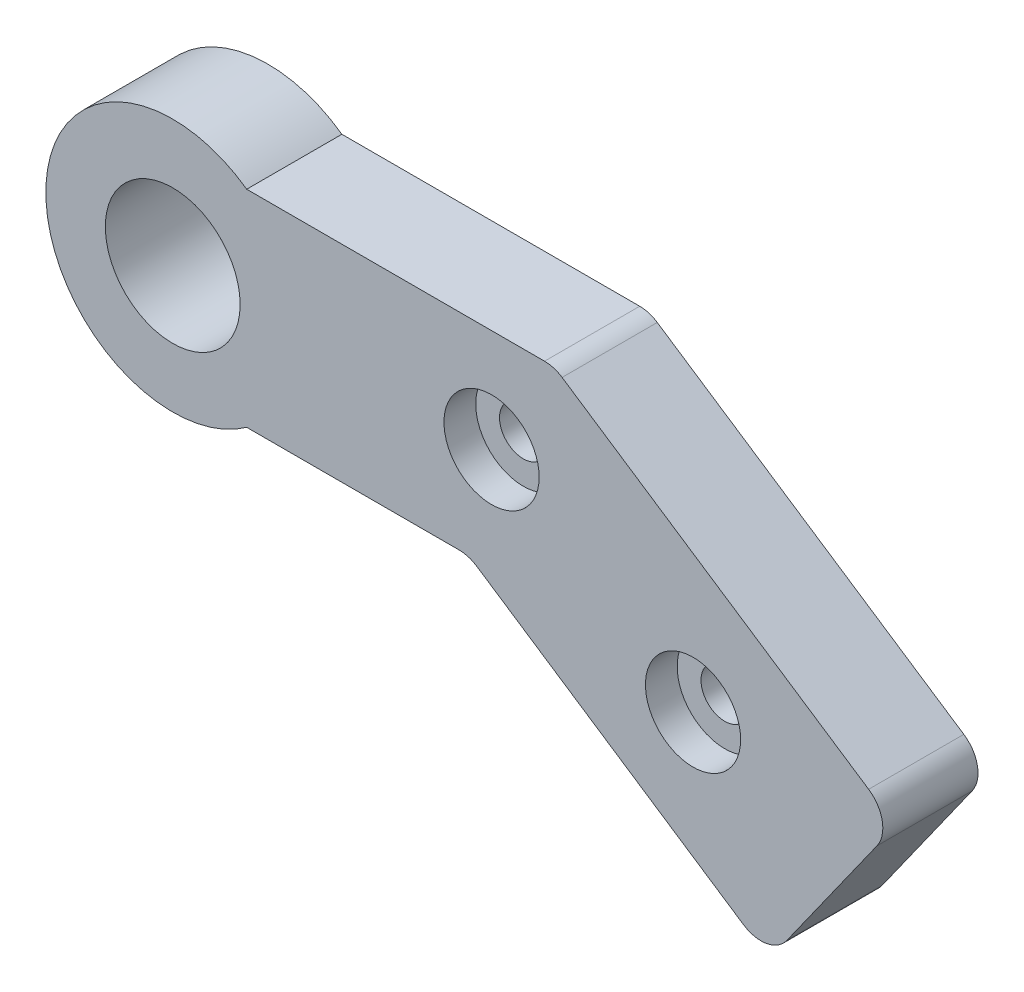
ISO-10303-21;
HEADER;
FILE_DESCRIPTION(('STEP AP214'),'2;1');
FILE_NAME('part.step','',(''),(''),'','','');
FILE_SCHEMA(('AUTOMOTIVE_DESIGN { 1 0 10303 214 1 1 1 1 }'));
ENDSEC;
DATA;
#1=APPLICATION_CONTEXT('core data for automotive mechanical design processes');
#2=APPLICATION_PROTOCOL_DEFINITION('international standard','automotive_design',2000,#1);
#3=PRODUCT_CONTEXT('',#1,'mechanical');
#4=PRODUCT('Part','Part','',(#3));
#5=PRODUCT_RELATED_PRODUCT_CATEGORY('part','',(#4));
#6=PRODUCT_DEFINITION_FORMATION('','',#4);
#7=PRODUCT_DEFINITION_CONTEXT('part definition',#1,'design');
#8=PRODUCT_DEFINITION('design','',#6,#7);
#9=PRODUCT_DEFINITION_SHAPE('','',#8);
#10=(LENGTH_UNIT() NAMED_UNIT(*) SI_UNIT(.MILLI.,.METRE.));
#11=(NAMED_UNIT(*) PLANE_ANGLE_UNIT() SI_UNIT($,.RADIAN.));
#12=(NAMED_UNIT(*) SI_UNIT($,.STERADIAN.) SOLID_ANGLE_UNIT());
#13=UNCERTAINTY_MEASURE_WITH_UNIT(LENGTH_MEASURE(1.E-05),#10,'distance_accuracy_value','');
#14=(GEOMETRIC_REPRESENTATION_CONTEXT(3) GLOBAL_UNCERTAINTY_ASSIGNED_CONTEXT((#13)) GLOBAL_UNIT_ASSIGNED_CONTEXT((#10,
#11,#12)) REPRESENTATION_CONTEXT('',''));
#15=CARTESIAN_POINT('',(0.,0.,0.));
#16=DIRECTION('',(0.,0.,1.));
#17=DIRECTION('',(1.,0.,0.));
#18=AXIS2_PLACEMENT_3D('',#15,#16,#17);
#19=CARTESIAN_POINT('',(11.4251973359151,-8.82299265858185,0.));
#20=DIRECTION('',(0.,0.,1.));
#21=DIRECTION('',(1.,0.,0.));
#22=AXIS2_PLACEMENT_3D('',#19,#20,#21);
#23=CYLINDRICAL_SURFACE('',#22,1.5);
#24=CARTESIAN_POINT('',(11.4251973359151,-8.82299265858185,0.));
#25=DIRECTION('',(0.,0.,1.));
#26=DIRECTION('',(1.,0.,0.));
#27=AXIS2_PLACEMENT_3D('',#24,#25,#26);
#28=CIRCLE('',#27,1.5);
#29=CARTESIAN_POINT('',(12.9251973359151,-8.82299265858185,0.));
#30=VERTEX_POINT('',#29);
#31=EDGE_CURVE('E175',#30,#30,#28,.T.);
#32=ORIENTED_EDGE('',*,*,#31,.F.);
#33=EDGE_LOOP('',(#32));
#34=FACE_BOUND('',#33,.T.);
#35=CARTESIAN_POINT('',(11.4251973359151,-8.82299265858185,4.));
#36=DIRECTION('',(0.,0.,1.));
#37=DIRECTION('',(1.,0.,0.));
#38=AXIS2_PLACEMENT_3D('',#35,#36,#37);
#39=CIRCLE('',#38,1.5);
#40=CARTESIAN_POINT('',(12.9251973359151,-8.82299265858185,4.));
#41=VERTEX_POINT('',#40);
#42=EDGE_CURVE('E37',#41,#41,#39,.F.);
#43=ORIENTED_EDGE('',*,*,#42,.F.);
#44=EDGE_LOOP('',(#43));
#45=FACE_BOUND('',#44,.T.);
#46=ADVANCED_FACE('F33',(#34,#45),#23,.F.);
#47=CARTESIAN_POINT('',(-1.2757727680621,-0.842681986817409,0.));
#48=DIRECTION('',(0.,0.,1.));
#49=DIRECTION('',(1.,0.,0.));
#50=AXIS2_PLACEMENT_3D('',#47,#48,#49);
#51=CYLINDRICAL_SURFACE('',#50,1.5);
#52=CARTESIAN_POINT('',(-1.2757727680621,-0.842681986817409,0.));
#53=DIRECTION('',(0.,0.,1.));
#54=DIRECTION('',(1.,0.,0.));
#55=AXIS2_PLACEMENT_3D('',#52,#53,#54);
#56=CIRCLE('',#55,1.5);
#57=CARTESIAN_POINT('',(0.224227231937896,-0.842681986817409,0.));
#58=VERTEX_POINT('',#57);
#59=EDGE_CURVE('E180',#58,#58,#56,.T.);
#60=ORIENTED_EDGE('',*,*,#59,.F.);
#61=EDGE_LOOP('',(#60));
#62=FACE_BOUND('',#61,.T.);
#63=CARTESIAN_POINT('',(-1.2757727680621,-0.842681986817409,4.));
#64=DIRECTION('',(0.,0.,1.));
#65=DIRECTION('',(1.,0.,0.));
#66=AXIS2_PLACEMENT_3D('',#63,#64,#65);
#67=CIRCLE('',#66,1.5);
#68=CARTESIAN_POINT('',(0.224227231937896,-0.842681986817409,4.));
#69=VERTEX_POINT('',#68);
#70=EDGE_CURVE('E173',#69,#69,#67,.F.);
#71=ORIENTED_EDGE('',*,*,#70,.F.);
#72=EDGE_LOOP('',(#71));
#73=FACE_BOUND('',#72,.T.);
#74=ADVANCED_FACE('F257',(#62,#73),#51,.F.);
#75=CARTESIAN_POINT('',(-21.3757727680621,-0.84268198681741,6.));
#76=DIRECTION('',(0.,0.,-1.));
#77=DIRECTION('',(-1.,0.,0.));
#78=AXIS2_PLACEMENT_3D('',#75,#76,#77);
#79=CYLINDRICAL_SURFACE('',#78,8.);
#80=CARTESIAN_POINT('',(-21.3757727680621,-0.84268198681741,0.));
#81=DIRECTION('',(0.,0.,1.));
#82=DIRECTION('',(1.,0.,0.));
#83=AXIS2_PLACEMENT_3D('',#80,#81,#82);
#84=CIRCLE('',#83,8.);
#85=CARTESIAN_POINT('',(-16.7120832415177,5.65731801318259,0.));
#86=VERTEX_POINT('',#85);
#87=CARTESIAN_POINT('',(-16.7120832415177,-7.34268198681741,0.));
#88=VERTEX_POINT('',#87);
#89=EDGE_CURVE('E138',#86,#88,#84,.T.);
#90=ORIENTED_EDGE('',*,*,#89,.T.);
#91=DIRECTION('',(0.,0.,-1.));
#92=VECTOR('',#91,1.);
#93=CARTESIAN_POINT('',(-16.7120832415177,-7.34268198681741,6.));
#94=LINE('',#93,#92);
#95=CARTESIAN_POINT('',(-16.7120832415177,-7.34268198681741,6.));
#96=VERTEX_POINT('',#95);
#97=EDGE_CURVE('E119',#96,#88,#94,.T.);
#98=ORIENTED_EDGE('',*,*,#97,.F.);
#99=CARTESIAN_POINT('',(-21.3757727680621,-0.84268198681741,6.));
#100=DIRECTION('',(0.,0.,1.));
#101=DIRECTION('',(1.,0.,0.));
#102=AXIS2_PLACEMENT_3D('',#99,#100,#101);
#103=CIRCLE('',#102,8.);
#104=CARTESIAN_POINT('',(-16.7120832415177,5.65731801318259,6.));
#105=VERTEX_POINT('',#104);
#106=EDGE_CURVE('E125',#105,#96,#103,.T.);
#107=ORIENTED_EDGE('',*,*,#106,.F.);
#108=DIRECTION('',(0.,0.,-1.));
#109=VECTOR('',#108,1.);
#110=CARTESIAN_POINT('',(-16.7120832415177,5.65731801318259,6.));
#111=LINE('',#110,#109);
#112=EDGE_CURVE('E140',#105,#86,#111,.T.);
#113=ORIENTED_EDGE('',*,*,#112,.T.);
#114=EDGE_LOOP('',(#90,#98,#107,#113));
#115=FACE_BOUND('',#114,.T.);
#116=ADVANCED_FACE('F136',(#115),#79,.T.);
#117=CARTESIAN_POINT('',(-16.7120832415177,-7.34268198681741,6.));
#118=DIRECTION('',(0.,1.,0.));
#119=DIRECTION('',(-1.,0.,0.));
#120=AXIS2_PLACEMENT_3D('',#117,#118,#119);
#121=PLANE('',#120);
#122=DIRECTION('',(1.,0.,0.));
#123=VECTOR('',#122,1.);
#124=CARTESIAN_POINT('',(-16.7120832415177,-7.34268198681741,0.));
#125=LINE('',#124,#123);
#126=CARTESIAN_POINT('',(-3.31530028571214,-7.34268198681741,0.));
#127=VERTEX_POINT('',#126);
#128=EDGE_CURVE('E208',#88,#127,#125,.T.);
#129=ORIENTED_EDGE('',*,*,#128,.T.);
#130=DIRECTION('',(0.,0.,-1.));
#131=VECTOR('',#130,1.);
#132=CARTESIAN_POINT('',(-3.31530028571214,-7.34268198681741,6.));
#133=LINE('',#132,#131);
#134=CARTESIAN_POINT('',(-3.31530028571214,-7.34268198681741,6.));
#135=VERTEX_POINT('',#134);
#136=EDGE_CURVE('E122',#127,#135,#133,.F.);
#137=ORIENTED_EDGE('',*,*,#136,.T.);
#138=DIRECTION('',(1.,0.,0.));
#139=VECTOR('',#138,1.);
#140=CARTESIAN_POINT('',(-16.7120832415177,-7.34268198681741,6.));
#141=LINE('',#140,#139);
#142=EDGE_CURVE('E114',#96,#135,#141,.T.);
#143=ORIENTED_EDGE('',*,*,#142,.F.);
#144=ORIENTED_EDGE('',*,*,#97,.T.);
#145=EDGE_LOOP('',(#129,#137,#143,#144));
#146=FACE_BOUND('',#145,.T.);
#147=ADVANCED_FACE('F117',(#146),#121,.F.);
#148=CARTESIAN_POINT('',(-2.7120832415177,-7.34268198681741,6.));
#149=DIRECTION('',(0.552919251286511,0.833234841780374,0.));
#150=DIRECTION('',(-0.833234841780374,0.552919251286511,0.));
#151=AXIS2_PLACEMENT_3D('',#148,#149,#150);
#152=PLANE('',#151);
#153=DIRECTION('',(0.833234841780374,-0.552919251286511,0.));
#154=VECTOR('',#153,1.);
#155=CARTESIAN_POINT('',(-2.7120832415177,-7.34268198681741,0.));
#156=LINE('',#155,#154);
#157=CARTESIAN_POINT('',(-2.20946178313912,-7.67621230325666,0.));
#158=VERTEX_POINT('',#157);
#159=CARTESIAN_POINT('',(14.604562838702,-18.8336884898703,0.));
#160=VERTEX_POINT('',#159);
#161=EDGE_CURVE('E210',#158,#160,#156,.T.);
#162=ORIENTED_EDGE('',*,*,#161,.T.);
#163=DIRECTION('',(0.,0.,-1.));
#164=VECTOR('',#163,1.);
#165=CARTESIAN_POINT('',(14.604562838702,-18.8336884898703,6.));
#166=LINE('',#165,#164);
#167=CARTESIAN_POINT('',(14.604562838702,-18.8336884898703,6.));
#168=VERTEX_POINT('',#167);
#169=EDGE_CURVE('E58',#160,#168,#166,.F.);
#170=ORIENTED_EDGE('',*,*,#169,.T.);
#171=DIRECTION('',(0.833234841780374,-0.552919251286511,0.));
#172=VECTOR('',#171,1.);
#173=CARTESIAN_POINT('',(-2.7120832415177,-7.34268198681741,6.));
#174=LINE('',#173,#172);
#175=CARTESIAN_POINT('',(-2.20946178313912,-7.67621230325666,6.));
#176=VERTEX_POINT('',#175);
#177=EDGE_CURVE('E124',#176,#168,#174,.T.);
#178=ORIENTED_EDGE('',*,*,#177,.F.);
#179=DIRECTION('',(0.,0.,-1.));
#180=VECTOR('',#179,1.);
#181=CARTESIAN_POINT('',(-2.20946178313912,-7.67621230325666,0.));
#182=LINE('',#181,#180);
#183=EDGE_CURVE('E165',#176,#158,#182,.T.);
#184=ORIENTED_EDGE('',*,*,#183,.T.);
#185=EDGE_LOOP('',(#162,#170,#178,#184));
#186=FACE_BOUND('',#185,.T.);
#187=ADVANCED_FACE('F229',(#186),#152,.F.);
#188=CARTESIAN_POINT('',(24.2150380111817,-8.64095367810427,6.));
#189=DIRECTION('',(-0.815456381362957,0.578818529501631,0.));
#190=DIRECTION('',(-0.578818529501631,-0.815456381362958,0.));
#191=AXIS2_PLACEMENT_3D('',#188,#189,#190);
#192=PLANE('',#191);
#193=DIRECTION('',(0.578818529501631,0.815456381362958,0.));
#194=VECTOR('',#193,1.);
#195=CARTESIAN_POINT('',(24.2150380111817,-8.64095367810427,0.));
#196=LINE('',#195,#194);
#197=CARTESIAN_POINT('',(17.3413141040009,-18.3248558653128,0.));
#198=VERTEX_POINT('',#197);
#199=CARTESIAN_POINT('',(23.020449863831,-10.3239242089482,0.));
#200=VERTEX_POINT('',#199);
#201=EDGE_CURVE('E212',#198,#200,#196,.T.);
#202=ORIENTED_EDGE('',*,*,#201,.T.);
#203=DIRECTION('',(0.,0.,-1.));
#204=VECTOR('',#203,1.);
#205=CARTESIAN_POINT('',(23.020449863831,-10.3239242089482,6.));
#206=LINE('',#205,#204);
#207=CARTESIAN_POINT('',(23.020449863831,-10.3239242089482,6.));
#208=VERTEX_POINT('',#207);
#209=EDGE_CURVE('E158',#200,#208,#206,.F.);
#210=ORIENTED_EDGE('',*,*,#209,.T.);
#211=DIRECTION('',(0.578818529501631,0.815456381362958,0.));
#212=VECTOR('',#211,1.);
#213=CARTESIAN_POINT('',(24.2150380111817,-8.64095367810427,6.));
#214=LINE('',#213,#212);
#215=CARTESIAN_POINT('',(17.3413141040009,-18.3248558653128,6.));
#216=VERTEX_POINT('',#215);
#217=EDGE_CURVE('E202',#216,#208,#214,.T.);
#218=ORIENTED_EDGE('',*,*,#217,.F.);
#219=DIRECTION('',(0.,0.,-1.));
#220=VECTOR('',#219,1.);
#221=CARTESIAN_POINT('',(17.3413141040009,-18.3248558653128,6.));
#222=LINE('',#221,#220);
#223=EDGE_CURVE('E155',#216,#198,#222,.T.);
#224=ORIENTED_EDGE('',*,*,#223,.T.);
#225=EDGE_LOOP('',(#202,#210,#218,#224));
#226=FACE_BOUND('',#225,.T.);
#227=ADVANCED_FACE('F236',(#226),#192,.F.);
#228=CARTESIAN_POINT('',(2.6679167584823,5.65731801318259,6.));
#229=DIRECTION('',(-0.552919251286511,-0.833234841780374,0.));
#230=DIRECTION('',(0.833234841780374,-0.552919251286511,0.));
#231=AXIS2_PLACEMENT_3D('',#228,#229,#230);
#232=PLANE('',#231);
#233=DIRECTION('',(-0.833234841780374,0.552919251286511,0.));
#234=VECTOR('',#233,1.);
#235=CARTESIAN_POINT('',(2.6679167584823,5.65731801318259,6.));
#236=LINE('',#235,#234);
#237=CARTESIAN_POINT('',(22.4953756036781,-7.49981746638419,6.));
#238=VERTEX_POINT('',#237);
#239=CARTESIAN_POINT('',(3.17053821686088,5.32378769674334,6.));
#240=VERTEX_POINT('',#239);
#241=EDGE_CURVE('E204',#238,#240,#236,.T.);
#242=ORIENTED_EDGE('',*,*,#241,.F.);
#243=DIRECTION('',(0.,0.,-1.));
#244=VECTOR('',#243,1.);
#245=CARTESIAN_POINT('',(22.4953756036781,-7.49981746638419,6.));
#246=LINE('',#245,#244);
#247=CARTESIAN_POINT('',(22.4953756036781,-7.49981746638419,0.));
#248=VERTEX_POINT('',#247);
#249=EDGE_CURVE('E142',#238,#248,#246,.T.);
#250=ORIENTED_EDGE('',*,*,#249,.T.);
#251=DIRECTION('',(-0.833234841780374,0.552919251286511,0.));
#252=VECTOR('',#251,1.);
#253=CARTESIAN_POINT('',(2.6679167584823,5.65731801318259,0.));
#254=LINE('',#253,#252);
#255=CARTESIAN_POINT('',(3.17053821686088,5.32378769674334,0.));
#256=VERTEX_POINT('',#255);
#257=EDGE_CURVE('E215',#248,#256,#254,.T.);
#258=ORIENTED_EDGE('',*,*,#257,.T.);
#259=DIRECTION('',(0.,0.,-1.));
#260=VECTOR('',#259,1.);
#261=CARTESIAN_POINT('',(3.17053821686088,5.32378769674334,6.));
#262=LINE('',#261,#260);
#263=EDGE_CURVE('E139',#256,#240,#262,.F.);
#264=ORIENTED_EDGE('',*,*,#263,.T.);
#265=EDGE_LOOP('',(#242,#250,#258,#264));
#266=FACE_BOUND('',#265,.T.);
#267=ADVANCED_FACE('F244',(#266),#232,.F.);
#268=CARTESIAN_POINT('',(-16.7120832415177,5.65731801318259,6.));
#269=DIRECTION('',(0.,-1.,0.));
#270=DIRECTION('',(0.,0.,-1.));
#271=AXIS2_PLACEMENT_3D('',#268,#269,#270);
#272=PLANE('',#271);
#273=DIRECTION('',(-1.,0.,0.));
#274=VECTOR('',#273,1.);
#275=CARTESIAN_POINT('',(-16.7120832415177,5.65731801318259,6.));
#276=LINE('',#275,#274);
#277=CARTESIAN_POINT('',(2.06469971428786,5.65731801318259,6.));
#278=VERTEX_POINT('',#277);
#279=EDGE_CURVE('E130',#278,#105,#276,.T.);
#280=ORIENTED_EDGE('',*,*,#279,.F.);
#281=DIRECTION('',(0.,0.,-1.));
#282=VECTOR('',#281,1.);
#283=CARTESIAN_POINT('',(2.06469971428786,5.65731801318259,6.));
#284=LINE('',#283,#282);
#285=CARTESIAN_POINT('',(2.06469971428786,5.65731801318259,0.));
#286=VERTEX_POINT('',#285);
#287=EDGE_CURVE('E170',#278,#286,#284,.T.);
#288=ORIENTED_EDGE('',*,*,#287,.T.);
#289=DIRECTION('',(-1.,0.,0.));
#290=VECTOR('',#289,1.);
#291=CARTESIAN_POINT('',(-16.7120832415177,5.65731801318259,0.));
#292=LINE('',#291,#290);
#293=EDGE_CURVE('E134',#286,#86,#292,.T.);
#294=ORIENTED_EDGE('',*,*,#293,.T.);
#295=ORIENTED_EDGE('',*,*,#112,.F.);
#296=EDGE_LOOP('',(#280,#288,#294,#295));
#297=FACE_BOUND('',#296,.T.);
#298=ADVANCED_FACE('F219',(#297),#272,.F.);
#299=CARTESIAN_POINT('',(-21.3757727680621,-0.84268198681741,6.));
#300=DIRECTION('',(0.,0.,1.));
#301=DIRECTION('',(1.,0.,0.));
#302=AXIS2_PLACEMENT_3D('',#299,#300,#301);
#303=PLANE('',#302);
#304=CARTESIAN_POINT('',(11.4251973359151,-8.82299265858185,6.));
#305=DIRECTION('',(0.,0.,1.));
#306=DIRECTION('',(1.,0.,0.));
#307=AXIS2_PLACEMENT_3D('',#304,#305,#306);
#308=CIRCLE('',#307,3.);
#309=CARTESIAN_POINT('',(14.4251973359151,-8.82299265858185,6.));
#310=VERTEX_POINT('',#309);
#311=EDGE_CURVE('E190',#310,#310,#308,.T.);
#312=ORIENTED_EDGE('',*,*,#311,.F.);
#313=EDGE_LOOP('',(#312));
#314=FACE_BOUND('',#313,.T.);
#315=CARTESIAN_POINT('',(-1.2757727680621,-0.842681986817409,6.));
#316=DIRECTION('',(0.,0.,1.));
#317=DIRECTION('',(1.,0.,0.));
#318=AXIS2_PLACEMENT_3D('',#315,#316,#317);
#319=CIRCLE('',#318,3.);
#320=CARTESIAN_POINT('',(1.7242272319379,-0.842681986817409,6.));
#321=VERTEX_POINT('',#320);
#322=EDGE_CURVE('E183',#321,#321,#319,.T.);
#323=ORIENTED_EDGE('',*,*,#322,.F.);
#324=EDGE_LOOP('',(#323));
#325=FACE_BOUND('',#324,.T.);
#326=CARTESIAN_POINT('',(-21.3757727680621,-0.842681986817409,6.));
#327=DIRECTION('',(0.,0.,1.));
#328=DIRECTION('',(1.,0.,0.));
#329=AXIS2_PLACEMENT_3D('',#326,#327,#328);
#330=CIRCLE('',#329,4.25);
#331=CARTESIAN_POINT('',(-17.1257727680621,-0.842681986817409,6.));
#332=VERTEX_POINT('',#331);
#333=EDGE_CURVE('E195',#332,#332,#330,.T.);
#334=ORIENTED_EDGE('',*,*,#333,.F.);
#335=EDGE_LOOP('',(#334));
#336=FACE_BOUND('',#335,.T.);
#337=ORIENTED_EDGE('',*,*,#217,.T.);
#338=CARTESIAN_POINT('',(21.3895371011051,-9.16628714994494,6.));
#339=DIRECTION('',(0.,0.,1.));
#340=DIRECTION('',(1.,0.,0.));
#341=AXIS2_PLACEMENT_3D('',#338,#339,#340);
#342=CIRCLE('',#341,2.);
#343=EDGE_CURVE('E163',#208,#238,#342,.T.);
#344=ORIENTED_EDGE('',*,*,#343,.T.);
#345=ORIENTED_EDGE('',*,*,#241,.T.);
#346=CARTESIAN_POINT('',(2.06469971428786,3.65731801318259,6.));
#347=DIRECTION('',(0.,0.,1.));
#348=DIRECTION('',(1.,0.,0.));
#349=AXIS2_PLACEMENT_3D('',#346,#347,#348);
#350=CIRCLE('',#349,2.);
#351=EDGE_CURVE('E50',#240,#278,#350,.T.);
#352=ORIENTED_EDGE('',*,*,#351,.T.);
#353=ORIENTED_EDGE('',*,*,#279,.T.);
#354=ORIENTED_EDGE('',*,*,#106,.T.);
#355=ORIENTED_EDGE('',*,*,#142,.T.);
#356=CARTESIAN_POINT('',(-3.31530028571214,-9.34268198681741,6.));
#357=DIRECTION('',(0.,0.,1.));
#358=DIRECTION('',(1.,0.,0.));
#359=AXIS2_PLACEMENT_3D('',#356,#357,#358);
#360=CIRCLE('',#359,2.);
#361=EDGE_CURVE('E11',#135,#176,#360,.F.);
#362=ORIENTED_EDGE('',*,*,#361,.T.);
#363=ORIENTED_EDGE('',*,*,#177,.T.);
#364=CARTESIAN_POINT('',(15.710401341275,-17.1672188063096,6.));
#365=DIRECTION('',(0.,0.,1.));
#366=DIRECTION('',(1.,0.,0.));
#367=AXIS2_PLACEMENT_3D('',#364,#365,#366);
#368=CIRCLE('',#367,2.);
#369=EDGE_CURVE('E161',#168,#216,#368,.T.);
#370=ORIENTED_EDGE('',*,*,#369,.T.);
#371=EDGE_LOOP('',(#337,#344,#345,#352,#353,#354,#355,#362,#363,#370));
#372=FACE_BOUND('',#371,.T.);
#373=ADVANCED_FACE('F129',(#314,#325,#336,#372),#303,.T.);
#374=CARTESIAN_POINT('',(-21.3757727680621,-0.84268198681741,0.));
#375=DIRECTION('',(0.,0.,1.));
#376=DIRECTION('',(1.,0.,0.));
#377=AXIS2_PLACEMENT_3D('',#374,#375,#376);
#378=PLANE('',#377);
#379=ORIENTED_EDGE('',*,*,#31,.T.);
#380=EDGE_LOOP('',(#379));
#381=FACE_BOUND('',#380,.T.);
#382=ORIENTED_EDGE('',*,*,#59,.T.);
#383=EDGE_LOOP('',(#382));
#384=FACE_BOUND('',#383,.T.);
#385=CARTESIAN_POINT('',(-21.3757727680621,-0.842681986817409,0.));
#386=DIRECTION('',(0.,0.,1.));
#387=DIRECTION('',(1.,0.,0.));
#388=AXIS2_PLACEMENT_3D('',#385,#386,#387);
#389=CIRCLE('',#388,4.25);
#390=CARTESIAN_POINT('',(-17.1257727680621,-0.842681986817409,0.));
#391=VERTEX_POINT('',#390);
#392=EDGE_CURVE('E196',#391,#391,#389,.T.);
#393=ORIENTED_EDGE('',*,*,#392,.T.);
#394=EDGE_LOOP('',(#393));
#395=FACE_BOUND('',#394,.T.);
#396=ORIENTED_EDGE('',*,*,#257,.F.);
#397=CARTESIAN_POINT('',(21.3895371011051,-9.16628714994494,0.));
#398=DIRECTION('',(0.,0.,1.));
#399=DIRECTION('',(1.,0.,0.));
#400=AXIS2_PLACEMENT_3D('',#397,#398,#399);
#401=CIRCLE('',#400,2.);
#402=EDGE_CURVE('E153',#248,#200,#401,.F.);
#403=ORIENTED_EDGE('',*,*,#402,.T.);
#404=ORIENTED_EDGE('',*,*,#201,.F.);
#405=CARTESIAN_POINT('',(15.710401341275,-17.1672188063096,0.));
#406=DIRECTION('',(0.,0.,1.));
#407=DIRECTION('',(1.,0.,0.));
#408=AXIS2_PLACEMENT_3D('',#405,#406,#407);
#409=CIRCLE('',#408,2.);
#410=EDGE_CURVE('E151',#198,#160,#409,.F.);
#411=ORIENTED_EDGE('',*,*,#410,.T.);
#412=ORIENTED_EDGE('',*,*,#161,.F.);
#413=CARTESIAN_POINT('',(-3.31530028571214,-9.34268198681741,0.));
#414=DIRECTION('',(0.,0.,1.));
#415=DIRECTION('',(1.,0.,0.));
#416=AXIS2_PLACEMENT_3D('',#413,#414,#415);
#417=CIRCLE('',#416,2.);
#418=EDGE_CURVE('E42',#158,#127,#417,.T.);
#419=ORIENTED_EDGE('',*,*,#418,.T.);
#420=ORIENTED_EDGE('',*,*,#128,.F.);
#421=ORIENTED_EDGE('',*,*,#89,.F.);
#422=ORIENTED_EDGE('',*,*,#293,.F.);
#423=CARTESIAN_POINT('',(2.06469971428786,3.65731801318259,0.));
#424=DIRECTION('',(0.,0.,1.));
#425=DIRECTION('',(1.,0.,0.));
#426=AXIS2_PLACEMENT_3D('',#423,#424,#425);
#427=CIRCLE('',#426,2.);
#428=EDGE_CURVE('E149',#286,#256,#427,.F.);
#429=ORIENTED_EDGE('',*,*,#428,.T.);
#430=EDGE_LOOP('',(#396,#403,#404,#411,#412,#419,#420,#421,#422,#429));
#431=FACE_BOUND('',#430,.T.);
#432=ADVANCED_FACE('F223',(#381,#384,#395,#431),#378,.F.);
#433=CARTESIAN_POINT('',(21.3895371011051,-9.16628714994494,6.));
#434=DIRECTION('',(0.,0.,-1.));
#435=DIRECTION('',(-1.,0.,0.));
#436=AXIS2_PLACEMENT_3D('',#433,#434,#435);
#437=CYLINDRICAL_SURFACE('',#436,2.);
#438=ORIENTED_EDGE('',*,*,#343,.F.);
#439=ORIENTED_EDGE('',*,*,#209,.F.);
#440=ORIENTED_EDGE('',*,*,#402,.F.);
#441=ORIENTED_EDGE('',*,*,#249,.F.);
#442=EDGE_LOOP('',(#438,#439,#440,#441));
#443=FACE_BOUND('',#442,.T.);
#444=ADVANCED_FACE('F242',(#443),#437,.T.);
#445=CARTESIAN_POINT('',(15.710401341275,-17.1672188063096,6.));
#446=DIRECTION('',(0.,0.,-1.));
#447=DIRECTION('',(-1.,0.,0.));
#448=AXIS2_PLACEMENT_3D('',#445,#446,#447);
#449=CYLINDRICAL_SURFACE('',#448,2.);
#450=ORIENTED_EDGE('',*,*,#369,.F.);
#451=ORIENTED_EDGE('',*,*,#169,.F.);
#452=ORIENTED_EDGE('',*,*,#410,.F.);
#453=ORIENTED_EDGE('',*,*,#223,.F.);
#454=EDGE_LOOP('',(#450,#451,#452,#453));
#455=FACE_BOUND('',#454,.T.);
#456=ADVANCED_FACE('F233',(#455),#449,.T.);
#457=CARTESIAN_POINT('',(-3.31530028571214,-9.34268198681741,6.));
#458=DIRECTION('',(0.,0.,1.));
#459=DIRECTION('',(1.,0.,0.));
#460=AXIS2_PLACEMENT_3D('',#457,#458,#459);
#461=CYLINDRICAL_SURFACE('',#460,2.);
#462=ORIENTED_EDGE('',*,*,#361,.F.);
#463=ORIENTED_EDGE('',*,*,#136,.F.);
#464=ORIENTED_EDGE('',*,*,#418,.F.);
#465=ORIENTED_EDGE('',*,*,#183,.F.);
#466=EDGE_LOOP('',(#462,#463,#464,#465));
#467=FACE_BOUND('',#466,.T.);
#468=ADVANCED_FACE('F226',(#467),#461,.F.);
#469=CARTESIAN_POINT('',(2.06469971428786,3.65731801318259,6.));
#470=DIRECTION('',(0.,0.,-1.));
#471=DIRECTION('',(-1.,0.,0.));
#472=AXIS2_PLACEMENT_3D('',#469,#470,#471);
#473=CYLINDRICAL_SURFACE('',#472,2.);
#474=ORIENTED_EDGE('',*,*,#351,.F.);
#475=ORIENTED_EDGE('',*,*,#263,.F.);
#476=ORIENTED_EDGE('',*,*,#428,.F.);
#477=ORIENTED_EDGE('',*,*,#287,.F.);
#478=EDGE_LOOP('',(#474,#475,#476,#477));
#479=FACE_BOUND('',#478,.T.);
#480=ADVANCED_FACE('F35',(#479),#473,.T.);
#481=CARTESIAN_POINT('',(-21.3757727680621,-0.842681986817409,0.));
#482=DIRECTION('',(0.,0.,1.));
#483=DIRECTION('',(1.,0.,0.));
#484=AXIS2_PLACEMENT_3D('',#481,#482,#483);
#485=CYLINDRICAL_SURFACE('',#484,4.25);
#486=ORIENTED_EDGE('',*,*,#392,.F.);
#487=EDGE_LOOP('',(#486));
#488=FACE_BOUND('',#487,.T.);
#489=ORIENTED_EDGE('',*,*,#333,.T.);
#490=EDGE_LOOP('',(#489));
#491=FACE_BOUND('',#490,.T.);
#492=ADVANCED_FACE('F248',(#488,#491),#485,.F.);
#493=CARTESIAN_POINT('',(-1.2757727680621,-0.842681986817409,4.));
#494=DIRECTION('',(0.,0.,1.));
#495=DIRECTION('',(1.,0.,0.));
#496=AXIS2_PLACEMENT_3D('',#493,#494,#495);
#497=PLANE('',#496);
#498=CARTESIAN_POINT('',(-1.2757727680621,-0.842681986817409,4.));
#499=DIRECTION('',(0.,0.,1.));
#500=DIRECTION('',(1.,0.,0.));
#501=AXIS2_PLACEMENT_3D('',#498,#499,#500);
#502=CIRCLE('',#501,3.);
#503=CARTESIAN_POINT('',(1.7242272319379,-0.842681986817409,4.));
#504=VERTEX_POINT('',#503);
#505=EDGE_CURVE('E176',#504,#504,#502,.T.);
#506=ORIENTED_EDGE('',*,*,#505,.T.);
#507=EDGE_LOOP('',(#506));
#508=FACE_BOUND('',#507,.T.);
#509=ORIENTED_EDGE('',*,*,#70,.T.);
#510=EDGE_LOOP('',(#509));
#511=FACE_BOUND('',#510,.T.);
#512=ADVANCED_FACE('F253',(#508,#511),#497,.T.);
#513=CARTESIAN_POINT('',(-1.2757727680621,-0.842681986817409,4.));
#514=DIRECTION('',(0.,0.,1.));
#515=DIRECTION('',(1.,0.,0.));
#516=AXIS2_PLACEMENT_3D('',#513,#514,#515);
#517=CYLINDRICAL_SURFACE('',#516,3.);
#518=ORIENTED_EDGE('',*,*,#505,.F.);
#519=EDGE_LOOP('',(#518));
#520=FACE_BOUND('',#519,.T.);
#521=ORIENTED_EDGE('',*,*,#322,.T.);
#522=EDGE_LOOP('',(#521));
#523=FACE_BOUND('',#522,.T.);
#524=ADVANCED_FACE('F268',(#520,#523),#517,.F.);
#525=CARTESIAN_POINT('',(11.4251973359151,-8.82299265858185,4.));
#526=DIRECTION('',(0.,0.,1.));
#527=DIRECTION('',(1.,0.,0.));
#528=AXIS2_PLACEMENT_3D('',#525,#526,#527);
#529=PLANE('',#528);
#530=CARTESIAN_POINT('',(11.4251973359151,-8.82299265858185,4.));
#531=DIRECTION('',(0.,0.,1.));
#532=DIRECTION('',(1.,0.,0.));
#533=AXIS2_PLACEMENT_3D('',#530,#531,#532);
#534=CIRCLE('',#533,3.);
#535=CARTESIAN_POINT('',(14.4251973359151,-8.82299265858185,4.));
#536=VERTEX_POINT('',#535);
#537=EDGE_CURVE('E376',#536,#536,#534,.T.);
#538=ORIENTED_EDGE('',*,*,#537,.T.);
#539=EDGE_LOOP('',(#538));
#540=FACE_BOUND('',#539,.T.);
#541=ORIENTED_EDGE('',*,*,#42,.T.);
#542=EDGE_LOOP('',(#541));
#543=FACE_BOUND('',#542,.T.);
#544=ADVANCED_FACE('F350',(#540,#543),#529,.T.);
#545=CARTESIAN_POINT('',(11.4251973359151,-8.82299265858185,4.));
#546=DIRECTION('',(0.,0.,1.));
#547=DIRECTION('',(1.,0.,0.));
#548=AXIS2_PLACEMENT_3D('',#545,#546,#547);
#549=CYLINDRICAL_SURFACE('',#548,3.);
#550=ORIENTED_EDGE('',*,*,#537,.F.);
#551=EDGE_LOOP('',(#550));
#552=FACE_BOUND('',#551,.T.);
#553=ORIENTED_EDGE('',*,*,#311,.T.);
#554=EDGE_LOOP('',(#553));
#555=FACE_BOUND('',#554,.T.);
#556=ADVANCED_FACE('F359',(#552,#555),#549,.F.);
#557=CLOSED_SHELL('',(#46,#74,#116,#147,#187,#227,#267,#298,#373,#432,#444,#456,#468,#480,#492,
#512,#524,#544,#556));
#558=MANIFOLD_SOLID_BREP('B2',#557);
#559=ADVANCED_BREP_SHAPE_REPRESENTATION('',(#18,#558),#14);
#560=SHAPE_DEFINITION_REPRESENTATION(#9,#559);
ENDSEC;
END-ISO-10303-21;
